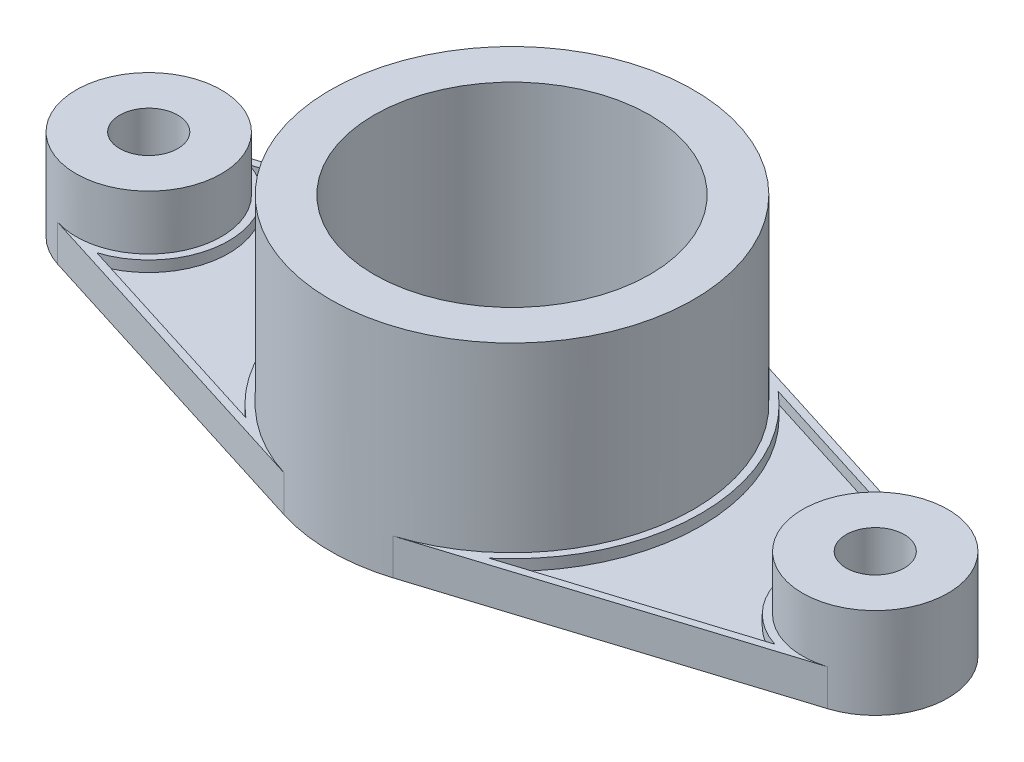
ISO-10303-21;
HEADER;
FILE_DESCRIPTION(('STEP AP214'),'2;1');
FILE_NAME('part.step','',(''),(''),'','','');
FILE_SCHEMA(('AUTOMOTIVE_DESIGN { 1 0 10303 214 1 1 1 1 }'));
ENDSEC;
DATA;
#1=APPLICATION_CONTEXT('core data for automotive mechanical design processes');
#2=APPLICATION_PROTOCOL_DEFINITION('international standard','automotive_design',2000,#1);
#3=PRODUCT_CONTEXT('',#1,'mechanical');
#4=PRODUCT('Part','Part','',(#3));
#5=PRODUCT_RELATED_PRODUCT_CATEGORY('part','',(#4));
#6=PRODUCT_DEFINITION_FORMATION('','',#4);
#7=PRODUCT_DEFINITION_CONTEXT('part definition',#1,'design');
#8=PRODUCT_DEFINITION('design','',#6,#7);
#9=PRODUCT_DEFINITION_SHAPE('','',#8);
#10=(LENGTH_UNIT() NAMED_UNIT(*) SI_UNIT(.MILLI.,.METRE.));
#11=(NAMED_UNIT(*) PLANE_ANGLE_UNIT() SI_UNIT($,.RADIAN.));
#12=(NAMED_UNIT(*) SI_UNIT($,.STERADIAN.) SOLID_ANGLE_UNIT());
#13=UNCERTAINTY_MEASURE_WITH_UNIT(LENGTH_MEASURE(1.E-05),#10,'distance_accuracy_value','');
#14=(GEOMETRIC_REPRESENTATION_CONTEXT(3) GLOBAL_UNCERTAINTY_ASSIGNED_CONTEXT((#13)) GLOBAL_UNIT_ASSIGNED_CONTEXT((#10,
#11,#12)) REPRESENTATION_CONTEXT('',''));
#15=CARTESIAN_POINT('',(0.,0.,0.));
#16=DIRECTION('',(0.,0.,1.));
#17=DIRECTION('',(1.,0.,0.));
#18=AXIS2_PLACEMENT_3D('',#15,#16,#17);
#19=CARTESIAN_POINT('',(0.,10.,0.));
#20=DIRECTION('',(0.,1.,0.));
#21=DIRECTION('',(0.,0.,1.));
#22=AXIS2_PLACEMENT_3D('',#19,#20,#21);
#23=PLANE('',#22);
#24=CARTESIAN_POINT('',(-99.9999999999994,10.,6.93889390390723E-13));
#25=DIRECTION('',(0.,-1.,0.));
#26=DIRECTION('',(0.,0.,-1.));
#27=AXIS2_PLACEMENT_3D('',#24,#25,#26);
#28=CIRCLE('',#27,22.);
#29=CARTESIAN_POINT('',(-93.3335174968009,10.,-20.9656388177064));
#30=VERTEX_POINT('',#29);
#31=CARTESIAN_POINT('',(-93.3335174968006,10.,20.9656388177077));
#32=VERTEX_POINT('',#31);
#33=EDGE_CURVE('E63',#30,#32,#28,.T.);
#34=ORIENTED_EDGE('',*,*,#33,.F.);
#35=DIRECTION('',(-0.953939201416943,0.,0.300000000000007));
#36=VECTOR('',#35,1.);
#37=CARTESIAN_POINT('',(-93.3335174968009,10.,-20.9656388177064));
#38=LINE('',#37,#36);
#39=CARTESIAN_POINT('',(-33.4787840283386,10.,-39.7890816680132));
#40=VERTEX_POINT('',#39);
#41=EDGE_CURVE('E183',#40,#30,#38,.T.);
#42=ORIENTED_EDGE('',*,*,#41,.F.);
#43=CARTESIAN_POINT('',(0.,10.,0.));
#44=DIRECTION('',(0.,-1.,0.));
#45=DIRECTION('',(0.,0.,-1.));
#46=AXIS2_PLACEMENT_3D('',#43,#44,#45);
#47=CIRCLE('',#46,51.9999999999996);
#48=CARTESIAN_POINT('',(-33.478784028338,10.,39.7890816680136));
#49=VERTEX_POINT('',#48);
#50=EDGE_CURVE('E187',#49,#40,#47,.T.);
#51=ORIENTED_EDGE('',*,*,#50,.F.);
#52=DIRECTION('',(0.953939201416948,0.,0.299999999999993));
#53=VECTOR('',#52,1.);
#54=CARTESIAN_POINT('',(-33.478784028338,10.,39.7890816680136));
#55=LINE('',#54,#53);
#56=EDGE_CURVE('E196',#32,#49,#55,.T.);
#57=ORIENTED_EDGE('',*,*,#56,.F.);
#58=EDGE_LOOP('',(#34,#42,#51,#57));
#59=FACE_BOUND('',#58,.T.);
#60=DIRECTION('',(-0.953939201416946,0.,-0.3));
#61=VECTOR('',#60,1.);
#62=CARTESIAN_POINT('',(-15.,10.,47.6969600708473));
#63=LINE('',#62,#61);
#64=CARTESIAN_POINT('',(-15.,10.,47.6969600708473));
#65=VERTEX_POINT('',#64);
#66=CARTESIAN_POINT('',(-106.,10.,19.0787840283389));
#67=VERTEX_POINT('',#66);
#68=EDGE_CURVE('E292',#65,#67,#63,.T.);
#69=ORIENTED_EDGE('',*,*,#68,.F.);
#70=CARTESIAN_POINT('',(0.,10.,0.));
#71=DIRECTION('',(0.,1.,0.));
#72=DIRECTION('',(0.,0.,1.));
#73=AXIS2_PLACEMENT_3D('',#70,#71,#72);
#74=CIRCLE('',#73,50.);
#75=CARTESIAN_POINT('',(-15.,10.,-47.6969600708473));
#76=VERTEX_POINT('',#75);
#77=EDGE_CURVE('E261',#65,#76,#74,.F.);
#78=ORIENTED_EDGE('',*,*,#77,.T.);
#79=DIRECTION('',(-0.953939201416946,0.,0.3));
#80=VECTOR('',#79,1.);
#81=CARTESIAN_POINT('',(-15.,10.,-47.6969600708473));
#82=LINE('',#81,#80);
#83=CARTESIAN_POINT('',(-106.,10.,-19.0787840283389));
#84=VERTEX_POINT('',#83);
#85=EDGE_CURVE('E288',#76,#84,#82,.T.);
#86=ORIENTED_EDGE('',*,*,#85,.T.);
#87=CARTESIAN_POINT('',(-100.,10.,0.));
#88=DIRECTION('',(0.,1.,0.));
#89=DIRECTION('',(0.,0.,1.));
#90=AXIS2_PLACEMENT_3D('',#87,#88,#89);
#91=CIRCLE('',#90,20.);
#92=EDGE_CURVE('E283',#67,#84,#91,.T.);
#93=ORIENTED_EDGE('',*,*,#92,.F.);
#94=EDGE_LOOP('',(#69,#78,#86,#93));
#95=FACE_BOUND('',#94,.T.);
#96=ADVANCED_FACE('F47',(#59,#95),#23,.T.);
#97=CARTESIAN_POINT('',(100.,10.,0.));
#98=DIRECTION('',(0.,-1.,0.));
#99=DIRECTION('',(0.,0.,1.));
#100=AXIS2_PLACEMENT_3D('',#97,#98,#99);
#101=CIRCLE('',#100,22.);
#102=CARTESIAN_POINT('',(93.3335174968013,10.,20.9656388177071));
#103=VERTEX_POINT('',#102);
#104=CARTESIAN_POINT('',(93.3335174968013,10.,-20.9656388177071));
#105=VERTEX_POINT('',#104);
#106=EDGE_CURVE('E71',#103,#105,#101,.T.);
#107=ORIENTED_EDGE('',*,*,#106,.F.);
#108=DIRECTION('',(0.953939201416946,0.,-0.3));
#109=VECTOR('',#108,1.);
#110=CARTESIAN_POINT('',(33.4787840283389,10.,39.7890816680134));
#111=LINE('',#110,#109);
#112=CARTESIAN_POINT('',(33.4787840283389,10.,39.7890816680134));
#113=VERTEX_POINT('',#112);
#114=EDGE_CURVE('E224',#113,#103,#111,.T.);
#115=ORIENTED_EDGE('',*,*,#114,.F.);
#116=CARTESIAN_POINT('',(0.,10.,0.));
#117=DIRECTION('',(0.,-1.,0.));
#118=DIRECTION('',(0.,0.,1.));
#119=AXIS2_PLACEMENT_3D('',#116,#117,#118);
#120=CIRCLE('',#119,52.);
#121=CARTESIAN_POINT('',(33.4787840283389,10.,-39.7890816680134));
#122=VERTEX_POINT('',#121);
#123=EDGE_CURVE('E228',#122,#113,#120,.T.);
#124=ORIENTED_EDGE('',*,*,#123,.F.);
#125=DIRECTION('',(-0.953939201416946,0.,-0.3));
#126=VECTOR('',#125,1.);
#127=CARTESIAN_POINT('',(93.3335174968013,10.,-20.9656388177071));
#128=LINE('',#127,#126);
#129=EDGE_CURVE('E233',#105,#122,#128,.T.);
#130=ORIENTED_EDGE('',*,*,#129,.F.);
#131=EDGE_LOOP('',(#107,#115,#124,#130));
#132=FACE_BOUND('',#131,.T.);
#133=DIRECTION('',(0.953939201416946,0.,0.3));
#134=VECTOR('',#133,1.);
#135=CARTESIAN_POINT('',(15.,10.,-47.6969600708473));
#136=LINE('',#135,#134);
#137=CARTESIAN_POINT('',(15.,10.,-47.6969600708473));
#138=VERTEX_POINT('',#137);
#139=CARTESIAN_POINT('',(106.,10.,-19.0787840283389));
#140=VERTEX_POINT('',#139);
#141=EDGE_CURVE('E301',#138,#140,#136,.T.);
#142=ORIENTED_EDGE('',*,*,#141,.F.);
#143=CARTESIAN_POINT('',(15.,10.,47.6969600708473));
#144=VERTEX_POINT('',#143);
#145=EDGE_CURVE('E260',#138,#144,#74,.F.);
#146=ORIENTED_EDGE('',*,*,#145,.T.);
#147=DIRECTION('',(0.953939201416946,0.,-0.3));
#148=VECTOR('',#147,1.);
#149=CARTESIAN_POINT('',(15.,10.,47.6969600708473));
#150=LINE('',#149,#148);
#151=CARTESIAN_POINT('',(106.,10.,19.0787840283389));
#152=VERTEX_POINT('',#151);
#153=EDGE_CURVE('E297',#144,#152,#150,.T.);
#154=ORIENTED_EDGE('',*,*,#153,.T.);
#155=CARTESIAN_POINT('',(100.,10.,0.));
#156=DIRECTION('',(0.,1.,0.));
#157=DIRECTION('',(0.,0.,1.));
#158=AXIS2_PLACEMENT_3D('',#155,#156,#157);
#159=CIRCLE('',#158,20.);
#160=EDGE_CURVE('E272',#152,#140,#159,.F.);
#161=ORIENTED_EDGE('',*,*,#160,.T.);
#162=EDGE_LOOP('',(#142,#146,#154,#161));
#163=FACE_BOUND('',#162,.T.);
#164=ADVANCED_FACE('F391',(#132,#163),#23,.T.);
#165=CARTESIAN_POINT('',(-15.,10.,-47.6969600708473));
#166=DIRECTION('',(0.3,0.,0.953939201416946));
#167=DIRECTION('',(0.953939201416946,0.,-0.3));
#168=AXIS2_PLACEMENT_3D('',#165,#166,#167);
#169=PLANE('',#168);
#170=DIRECTION('',(-0.953939201416946,0.,0.3));
#171=VECTOR('',#170,1.);
#172=CARTESIAN_POINT('',(-15.,0.,-47.6969600708473));
#173=LINE('',#172,#171);
#174=CARTESIAN_POINT('',(-15.,0.,-47.6969600708473));
#175=VERTEX_POINT('',#174);
#176=CARTESIAN_POINT('',(-106.,0.,-19.0787840283389));
#177=VERTEX_POINT('',#176);
#178=EDGE_CURVE('E287',#175,#177,#173,.T.);
#179=ORIENTED_EDGE('',*,*,#178,.T.);
#180=DIRECTION('',(0.,-1.,0.));
#181=VECTOR('',#180,1.);
#182=CARTESIAN_POINT('',(-106.,10.,-19.0787840283389));
#183=LINE('',#182,#181);
#184=EDGE_CURVE('E11',#84,#177,#183,.T.);
#185=ORIENTED_EDGE('',*,*,#184,.F.);
#186=ORIENTED_EDGE('',*,*,#85,.F.);
#187=DIRECTION('',(0.,-1.,0.));
#188=VECTOR('',#187,1.);
#189=CARTESIAN_POINT('',(-15.,10.,-47.6969600708473));
#190=LINE('',#189,#188);
#191=EDGE_CURVE('E305',#76,#175,#190,.T.);
#192=ORIENTED_EDGE('',*,*,#191,.T.);
#193=EDGE_LOOP('',(#179,#185,#186,#192));
#194=FACE_BOUND('',#193,.T.);
#195=ADVANCED_FACE('F49',(#194),#169,.F.);
#196=CARTESIAN_POINT('',(-100.,10.,0.));
#197=DIRECTION('',(0.,-1.,0.));
#198=DIRECTION('',(0.,0.,-1.));
#199=AXIS2_PLACEMENT_3D('',#196,#197,#198);
#200=CYLINDRICAL_SURFACE('',#199,20.);
#201=CARTESIAN_POINT('',(-100.,0.,0.));
#202=DIRECTION('',(0.,1.,0.));
#203=DIRECTION('',(0.,0.,1.));
#204=AXIS2_PLACEMENT_3D('',#201,#202,#203);
#205=CIRCLE('',#204,20.);
#206=CARTESIAN_POINT('',(-106.,0.,19.0787840283389));
#207=VERTEX_POINT('',#206);
#208=EDGE_CURVE('E309',#207,#177,#205,.F.);
#209=ORIENTED_EDGE('',*,*,#208,.F.);
#210=DIRECTION('',(0.,-1.,0.));
#211=VECTOR('',#210,1.);
#212=CARTESIAN_POINT('',(-106.,10.,19.0787840283389));
#213=LINE('',#212,#211);
#214=EDGE_CURVE('E56',#67,#207,#213,.T.);
#215=ORIENTED_EDGE('',*,*,#214,.F.);
#216=ORIENTED_EDGE('',*,*,#92,.T.);
#217=ORIENTED_EDGE('',*,*,#184,.T.);
#218=EDGE_LOOP('',(#209,#215,#216,#217));
#219=FACE_BOUND('',#218,.T.);
#220=CARTESIAN_POINT('',(-100.,25.,0.));
#221=DIRECTION('',(0.,1.,0.));
#222=DIRECTION('',(0.,0.,1.));
#223=AXIS2_PLACEMENT_3D('',#220,#221,#222);
#224=CIRCLE('',#223,20.);
#225=CARTESIAN_POINT('',(-100.,25.,20.));
#226=VERTEX_POINT('',#225);
#227=EDGE_CURVE('E275',#226,#226,#224,.F.);
#228=ORIENTED_EDGE('',*,*,#227,.T.);
#229=EDGE_LOOP('',(#228));
#230=FACE_BOUND('',#229,.T.);
#231=ADVANCED_FACE('F370',(#219,#230),#200,.T.);
#232=CARTESIAN_POINT('',(-15.,10.,47.6969600708473));
#233=DIRECTION('',(-0.3,0.,0.953939201416946));
#234=DIRECTION('',(0.953939201416946,0.,0.3));
#235=AXIS2_PLACEMENT_3D('',#232,#233,#234);
#236=PLANE('',#235);
#237=DIRECTION('',(-0.953939201416946,0.,-0.3));
#238=VECTOR('',#237,1.);
#239=CARTESIAN_POINT('',(-15.,0.,47.6969600708473));
#240=LINE('',#239,#238);
#241=CARTESIAN_POINT('',(-15.,0.,47.6969600708473));
#242=VERTEX_POINT('',#241);
#243=EDGE_CURVE('E313',#242,#207,#240,.T.);
#244=ORIENTED_EDGE('',*,*,#243,.F.);
#245=DIRECTION('',(0.,-1.,0.));
#246=VECTOR('',#245,1.);
#247=CARTESIAN_POINT('',(-15.,10.,47.6969600708473));
#248=LINE('',#247,#246);
#249=EDGE_CURVE('E360',#65,#242,#248,.T.);
#250=ORIENTED_EDGE('',*,*,#249,.F.);
#251=ORIENTED_EDGE('',*,*,#68,.T.);
#252=ORIENTED_EDGE('',*,*,#214,.T.);
#253=EDGE_LOOP('',(#244,#250,#251,#252));
#254=FACE_BOUND('',#253,.T.);
#255=ADVANCED_FACE('F367',(#254),#236,.T.);
#256=CARTESIAN_POINT('',(15.,10.,47.6969600708473));
#257=DIRECTION('',(-0.3,0.,-0.953939201416946));
#258=DIRECTION('',(-0.953939201416946,0.,0.3));
#259=AXIS2_PLACEMENT_3D('',#256,#257,#258);
#260=PLANE('',#259);
#261=DIRECTION('',(0.953939201416946,0.,-0.3));
#262=VECTOR('',#261,1.);
#263=CARTESIAN_POINT('',(15.,0.,47.6969600708473));
#264=LINE('',#263,#262);
#265=CARTESIAN_POINT('',(15.,0.,47.6969600708473));
#266=VERTEX_POINT('',#265);
#267=CARTESIAN_POINT('',(106.,0.,19.0787840283389));
#268=VERTEX_POINT('',#267);
#269=EDGE_CURVE('E320',#266,#268,#264,.T.);
#270=ORIENTED_EDGE('',*,*,#269,.T.);
#271=DIRECTION('',(0.,-1.,0.));
#272=VECTOR('',#271,1.);
#273=CARTESIAN_POINT('',(106.,10.,19.0787840283389));
#274=LINE('',#273,#272);
#275=EDGE_CURVE('E352',#152,#268,#274,.T.);
#276=ORIENTED_EDGE('',*,*,#275,.F.);
#277=ORIENTED_EDGE('',*,*,#153,.F.);
#278=DIRECTION('',(0.,-1.,0.));
#279=VECTOR('',#278,1.);
#280=CARTESIAN_POINT('',(15.,10.,47.6969600708473));
#281=LINE('',#280,#279);
#282=EDGE_CURVE('E356',#144,#266,#281,.T.);
#283=ORIENTED_EDGE('',*,*,#282,.T.);
#284=EDGE_LOOP('',(#270,#276,#277,#283));
#285=FACE_BOUND('',#284,.T.);
#286=ADVANCED_FACE('F387',(#285),#260,.F.);
#287=CARTESIAN_POINT('',(100.,10.,0.));
#288=DIRECTION('',(0.,-1.,0.));
#289=DIRECTION('',(0.,0.,-1.));
#290=AXIS2_PLACEMENT_3D('',#287,#288,#289);
#291=CYLINDRICAL_SURFACE('',#290,20.);
#292=CARTESIAN_POINT('',(100.,0.,0.));
#293=DIRECTION('',(0.,1.,0.));
#294=DIRECTION('',(0.,0.,1.));
#295=AXIS2_PLACEMENT_3D('',#292,#293,#294);
#296=CIRCLE('',#295,20.);
#297=CARTESIAN_POINT('',(106.,0.,-19.0787840283389));
#298=VERTEX_POINT('',#297);
#299=EDGE_CURVE('E324',#268,#298,#296,.T.);
#300=ORIENTED_EDGE('',*,*,#299,.T.);
#301=DIRECTION('',(0.,-1.,0.));
#302=VECTOR('',#301,1.);
#303=CARTESIAN_POINT('',(106.,10.,-19.0787840283389));
#304=LINE('',#303,#302);
#305=EDGE_CURVE('E349',#140,#298,#304,.T.);
#306=ORIENTED_EDGE('',*,*,#305,.F.);
#307=ORIENTED_EDGE('',*,*,#160,.F.);
#308=ORIENTED_EDGE('',*,*,#275,.T.);
#309=EDGE_LOOP('',(#300,#306,#307,#308));
#310=FACE_BOUND('',#309,.T.);
#311=CARTESIAN_POINT('',(100.,25.,0.));
#312=DIRECTION('',(0.,1.,0.));
#313=DIRECTION('',(0.,0.,1.));
#314=AXIS2_PLACEMENT_3D('',#311,#312,#313);
#315=CIRCLE('',#314,20.);
#316=CARTESIAN_POINT('',(100.,25.,20.));
#317=VERTEX_POINT('',#316);
#318=EDGE_CURVE('E268',#317,#317,#315,.T.);
#319=ORIENTED_EDGE('',*,*,#318,.F.);
#320=EDGE_LOOP('',(#319));
#321=FACE_BOUND('',#320,.T.);
#322=ADVANCED_FACE('F432',(#310,#321),#291,.T.);
#323=CARTESIAN_POINT('',(15.,10.,-47.6969600708473));
#324=DIRECTION('',(0.3,0.,-0.953939201416946));
#325=DIRECTION('',(-0.953939201416946,0.,-0.3));
#326=AXIS2_PLACEMENT_3D('',#323,#324,#325);
#327=PLANE('',#326);
#328=DIRECTION('',(0.953939201416946,0.,0.3));
#329=VECTOR('',#328,1.);
#330=CARTESIAN_POINT('',(15.,0.,-47.6969600708473));
#331=LINE('',#330,#329);
#332=CARTESIAN_POINT('',(15.,0.,-47.6969600708473));
#333=VERTEX_POINT('',#332);
#334=EDGE_CURVE('E328',#333,#298,#331,.T.);
#335=ORIENTED_EDGE('',*,*,#334,.F.);
#336=DIRECTION('',(0.,-1.,0.));
#337=VECTOR('',#336,1.);
#338=CARTESIAN_POINT('',(15.,10.,-47.6969600708473));
#339=LINE('',#338,#337);
#340=EDGE_CURVE('E346',#138,#333,#339,.T.);
#341=ORIENTED_EDGE('',*,*,#340,.F.);
#342=ORIENTED_EDGE('',*,*,#141,.T.);
#343=ORIENTED_EDGE('',*,*,#305,.T.);
#344=EDGE_LOOP('',(#335,#341,#342,#343));
#345=FACE_BOUND('',#344,.T.);
#346=ADVANCED_FACE('F423',(#345),#327,.T.);
#347=CARTESIAN_POINT('',(-100.,10.,0.));
#348=DIRECTION('',(0.,-1.,0.));
#349=DIRECTION('',(0.,0.,-1.));
#350=AXIS2_PLACEMENT_3D('',#347,#348,#349);
#351=CYLINDRICAL_SURFACE('',#350,8.00000000000001);
#352=CARTESIAN_POINT('',(-100.,0.,0.));
#353=DIRECTION('',(0.,1.,0.));
#354=DIRECTION('',(0.,0.,1.));
#355=AXIS2_PLACEMENT_3D('',#352,#353,#354);
#356=CIRCLE('',#355,8.00000000000001);
#357=CARTESIAN_POINT('',(-100.,0.,8.00000000000004));
#358=VERTEX_POINT('',#357);
#359=EDGE_CURVE('E336',#358,#358,#356,.F.);
#360=ORIENTED_EDGE('',*,*,#359,.T.);
#361=EDGE_LOOP('',(#360));
#362=FACE_BOUND('',#361,.T.);
#363=CARTESIAN_POINT('',(-100.,25.,0.));
#364=DIRECTION('',(0.,1.,0.));
#365=DIRECTION('',(0.,0.,1.));
#366=AXIS2_PLACEMENT_3D('',#363,#364,#365);
#367=CIRCLE('',#366,8.00000000000001);
#368=CARTESIAN_POINT('',(-100.,25.,8.00000000000004));
#369=VERTEX_POINT('',#368);
#370=EDGE_CURVE('E279',#369,#369,#367,.F.);
#371=ORIENTED_EDGE('',*,*,#370,.F.);
#372=EDGE_LOOP('',(#371));
#373=FACE_BOUND('',#372,.T.);
#374=ADVANCED_FACE('F419',(#362,#373),#351,.F.);
#375=CARTESIAN_POINT('',(0.,10.,0.));
#376=DIRECTION('',(0.,-1.,0.));
#377=DIRECTION('',(0.,0.,-1.));
#378=AXIS2_PLACEMENT_3D('',#375,#376,#377);
#379=CYLINDRICAL_SURFACE('',#378,38.);
#380=CARTESIAN_POINT('',(0.,0.,0.));
#381=DIRECTION('',(0.,1.,0.));
#382=DIRECTION('',(0.,0.,1.));
#383=AXIS2_PLACEMENT_3D('',#380,#381,#382);
#384=CIRCLE('',#383,38.);
#385=CARTESIAN_POINT('',(0.,0.,38.));
#386=VERTEX_POINT('',#385);
#387=EDGE_CURVE('E332',#386,#386,#384,.T.);
#388=ORIENTED_EDGE('',*,*,#387,.F.);
#389=EDGE_LOOP('',(#388));
#390=FACE_BOUND('',#389,.T.);
#391=CARTESIAN_POINT('',(0.,60.,0.));
#392=DIRECTION('',(0.,1.,0.));
#393=DIRECTION('',(0.,0.,1.));
#394=AXIS2_PLACEMENT_3D('',#391,#392,#393);
#395=CIRCLE('',#394,38.);
#396=CARTESIAN_POINT('',(0.,60.,38.));
#397=VERTEX_POINT('',#396);
#398=EDGE_CURVE('E205',#397,#397,#395,.T.);
#399=ORIENTED_EDGE('',*,*,#398,.T.);
#400=EDGE_LOOP('',(#399));
#401=FACE_BOUND('',#400,.T.);
#402=ADVANCED_FACE('F422',(#390,#401),#379,.F.);
#403=CARTESIAN_POINT('',(0.,10.,0.));
#404=DIRECTION('',(0.,-1.,0.));
#405=DIRECTION('',(0.,0.,-1.));
#406=AXIS2_PLACEMENT_3D('',#403,#404,#405);
#407=CYLINDRICAL_SURFACE('',#406,50.);
#408=CARTESIAN_POINT('',(0.,0.,0.));
#409=DIRECTION('',(0.,1.,0.));
#410=DIRECTION('',(0.,0.,1.));
#411=AXIS2_PLACEMENT_3D('',#408,#409,#410);
#412=CIRCLE('',#411,50.);
#413=EDGE_CURVE('E321',#333,#175,#412,.T.);
#414=ORIENTED_EDGE('',*,*,#413,.T.);
#415=ORIENTED_EDGE('',*,*,#191,.F.);
#416=ORIENTED_EDGE('',*,*,#77,.F.);
#417=ORIENTED_EDGE('',*,*,#249,.T.);
#418=EDGE_CURVE('E317',#242,#266,#412,.T.);
#419=ORIENTED_EDGE('',*,*,#418,.T.);
#420=ORIENTED_EDGE('',*,*,#282,.F.);
#421=ORIENTED_EDGE('',*,*,#145,.F.);
#422=ORIENTED_EDGE('',*,*,#340,.T.);
#423=EDGE_LOOP('',(#414,#415,#416,#417,#419,#420,#421,#422));
#424=FACE_BOUND('',#423,.T.);
#425=CARTESIAN_POINT('',(0.,60.,0.));
#426=DIRECTION('',(0.,1.,0.));
#427=DIRECTION('',(0.,0.,1.));
#428=AXIS2_PLACEMENT_3D('',#425,#426,#427);
#429=CIRCLE('',#428,50.);
#430=CARTESIAN_POINT('',(0.,60.,50.));
#431=VERTEX_POINT('',#430);
#432=EDGE_CURVE('E256',#431,#431,#429,.T.);
#433=ORIENTED_EDGE('',*,*,#432,.F.);
#434=EDGE_LOOP('',(#433));
#435=FACE_BOUND('',#434,.T.);
#436=ADVANCED_FACE('F381',(#424,#435),#407,.T.);
#437=CARTESIAN_POINT('',(100.,10.,0.));
#438=DIRECTION('',(0.,-1.,0.));
#439=DIRECTION('',(0.,0.,-1.));
#440=AXIS2_PLACEMENT_3D('',#437,#438,#439);
#441=CYLINDRICAL_SURFACE('',#440,8.00000000000001);
#442=CARTESIAN_POINT('',(100.,0.,0.));
#443=DIRECTION('',(0.,1.,0.));
#444=DIRECTION('',(0.,0.,1.));
#445=AXIS2_PLACEMENT_3D('',#442,#443,#444);
#446=CIRCLE('',#445,8.00000000000001);
#447=CARTESIAN_POINT('',(100.,0.,8.00000000000001));
#448=VERTEX_POINT('',#447);
#449=EDGE_CURVE('E293',#448,#448,#446,.T.);
#450=ORIENTED_EDGE('',*,*,#449,.F.);
#451=EDGE_LOOP('',(#450));
#452=FACE_BOUND('',#451,.T.);
#453=CARTESIAN_POINT('',(100.,25.,0.));
#454=DIRECTION('',(0.,1.,0.));
#455=DIRECTION('',(0.,0.,1.));
#456=AXIS2_PLACEMENT_3D('',#453,#454,#455);
#457=CIRCLE('',#456,8.00000000000001);
#458=CARTESIAN_POINT('',(100.,25.,8.00000000000001));
#459=VERTEX_POINT('',#458);
#460=EDGE_CURVE('E264',#459,#459,#457,.T.);
#461=ORIENTED_EDGE('',*,*,#460,.T.);
#462=EDGE_LOOP('',(#461));
#463=FACE_BOUND('',#462,.T.);
#464=ADVANCED_FACE('F415',(#452,#463),#441,.F.);
#465=CARTESIAN_POINT('',(0.,0.,0.));
#466=DIRECTION('',(0.,1.,0.));
#467=DIRECTION('',(0.,0.,1.));
#468=AXIS2_PLACEMENT_3D('',#465,#466,#467);
#469=PLANE('',#468);
#470=ORIENTED_EDGE('',*,*,#418,.F.);
#471=ORIENTED_EDGE('',*,*,#243,.T.);
#472=ORIENTED_EDGE('',*,*,#208,.T.);
#473=ORIENTED_EDGE('',*,*,#178,.F.);
#474=ORIENTED_EDGE('',*,*,#413,.F.);
#475=ORIENTED_EDGE('',*,*,#334,.T.);
#476=ORIENTED_EDGE('',*,*,#299,.F.);
#477=ORIENTED_EDGE('',*,*,#269,.F.);
#478=EDGE_LOOP('',(#470,#471,#472,#473,#474,#475,#476,#477));
#479=FACE_BOUND('',#478,.T.);
#480=ORIENTED_EDGE('',*,*,#387,.T.);
#481=EDGE_LOOP('',(#480));
#482=FACE_BOUND('',#481,.T.);
#483=ORIENTED_EDGE('',*,*,#449,.T.);
#484=EDGE_LOOP('',(#483));
#485=FACE_BOUND('',#484,.T.);
#486=ORIENTED_EDGE('',*,*,#359,.F.);
#487=EDGE_LOOP('',(#486));
#488=FACE_BOUND('',#487,.T.);
#489=ADVANCED_FACE('F375',(#479,#482,#485,#488),#469,.F.);
#490=CARTESIAN_POINT('',(0.,25.,0.));
#491=DIRECTION('',(0.,1.,0.));
#492=DIRECTION('',(0.,0.,1.));
#493=AXIS2_PLACEMENT_3D('',#490,#491,#492);
#494=PLANE('',#493);
#495=ORIENTED_EDGE('',*,*,#227,.F.);
#496=EDGE_LOOP('',(#495));
#497=FACE_BOUND('',#496,.T.);
#498=ORIENTED_EDGE('',*,*,#370,.T.);
#499=EDGE_LOOP('',(#498));
#500=FACE_BOUND('',#499,.T.);
#501=ADVANCED_FACE('F411',(#497,#500),#494,.T.);
#502=CARTESIAN_POINT('',(0.,25.,0.));
#503=DIRECTION('',(0.,1.,0.));
#504=DIRECTION('',(0.,0.,1.));
#505=AXIS2_PLACEMENT_3D('',#502,#503,#504);
#506=PLANE('',#505);
#507=ORIENTED_EDGE('',*,*,#460,.F.);
#508=EDGE_LOOP('',(#507));
#509=FACE_BOUND('',#508,.T.);
#510=ORIENTED_EDGE('',*,*,#318,.T.);
#511=EDGE_LOOP('',(#510));
#512=FACE_BOUND('',#511,.T.);
#513=ADVANCED_FACE('F451',(#509,#512),#506,.T.);
#514=CARTESIAN_POINT('',(0.,60.,0.));
#515=DIRECTION('',(0.,1.,0.));
#516=DIRECTION('',(0.,0.,1.));
#517=AXIS2_PLACEMENT_3D('',#514,#515,#516);
#518=PLANE('',#517);
#519=ORIENTED_EDGE('',*,*,#398,.F.);
#520=EDGE_LOOP('',(#519));
#521=FACE_BOUND('',#520,.T.);
#522=ORIENTED_EDGE('',*,*,#432,.T.);
#523=EDGE_LOOP('',(#522));
#524=FACE_BOUND('',#523,.T.);
#525=ADVANCED_FACE('F484',(#521,#524),#518,.T.);
#526=CARTESIAN_POINT('',(100.,7.,0.));
#527=DIRECTION('',(0.,1.,0.));
#528=DIRECTION('',(0.,0.,1.));
#529=AXIS2_PLACEMENT_3D('',#526,#527,#528);
#530=CYLINDRICAL_SURFACE('',#529,22.);
#531=ORIENTED_EDGE('',*,*,#106,.T.);
#532=DIRECTION('',(0.,1.,0.));
#533=VECTOR('',#532,1.);
#534=CARTESIAN_POINT('',(93.3335174968013,7.,-20.9656388177071));
#535=LINE('',#534,#533);
#536=CARTESIAN_POINT('',(93.3335174968013,7.,-20.9656388177071));
#537=VERTEX_POINT('',#536);
#538=EDGE_CURVE('E211',#537,#105,#535,.T.);
#539=ORIENTED_EDGE('',*,*,#538,.F.);
#540=CARTESIAN_POINT('',(100.,7.,0.));
#541=DIRECTION('',(0.,-1.,0.));
#542=DIRECTION('',(0.,0.,1.));
#543=AXIS2_PLACEMENT_3D('',#540,#541,#542);
#544=CIRCLE('',#543,22.);
#545=CARTESIAN_POINT('',(93.3335174968013,7.,20.9656388177071));
#546=VERTEX_POINT('',#545);
#547=EDGE_CURVE('E229',#546,#537,#544,.T.);
#548=ORIENTED_EDGE('',*,*,#547,.F.);
#549=DIRECTION('',(0.,1.,0.));
#550=VECTOR('',#549,1.);
#551=CARTESIAN_POINT('',(93.3335174968013,7.,20.9656388177071));
#552=LINE('',#551,#550);
#553=EDGE_CURVE('E221',#546,#103,#552,.T.);
#554=ORIENTED_EDGE('',*,*,#553,.T.);
#555=EDGE_LOOP('',(#531,#539,#548,#554));
#556=FACE_BOUND('',#555,.T.);
#557=ADVANCED_FACE('F486',(#556),#530,.T.);
#558=CARTESIAN_POINT('',(33.4787840283389,7.,39.7890816680134));
#559=DIRECTION('',(0.3,0.,0.953939201416946));
#560=DIRECTION('',(0.953939201416946,0.,-0.3));
#561=AXIS2_PLACEMENT_3D('',#558,#559,#560);
#562=PLANE('',#561);
#563=ORIENTED_EDGE('',*,*,#114,.T.);
#564=ORIENTED_EDGE('',*,*,#553,.F.);
#565=DIRECTION('',(0.953939201416946,0.,-0.3));
#566=VECTOR('',#565,1.);
#567=CARTESIAN_POINT('',(33.4787840283389,7.,39.7890816680134));
#568=LINE('',#567,#566);
#569=CARTESIAN_POINT('',(33.4787840283389,7.,39.7890816680134));
#570=VERTEX_POINT('',#569);
#571=EDGE_CURVE('E214',#570,#546,#568,.T.);
#572=ORIENTED_EDGE('',*,*,#571,.F.);
#573=DIRECTION('',(0.,1.,0.));
#574=VECTOR('',#573,1.);
#575=CARTESIAN_POINT('',(33.4787840283389,7.,39.7890816680134));
#576=LINE('',#575,#574);
#577=EDGE_CURVE('E218',#570,#113,#576,.T.);
#578=ORIENTED_EDGE('',*,*,#577,.T.);
#579=EDGE_LOOP('',(#563,#564,#572,#578));
#580=FACE_BOUND('',#579,.T.);
#581=ADVANCED_FACE('F499',(#580),#562,.F.);
#582=CARTESIAN_POINT('',(0.,7.,0.));
#583=DIRECTION('',(0.,1.,0.));
#584=DIRECTION('',(0.,0.,1.));
#585=AXIS2_PLACEMENT_3D('',#582,#583,#584);
#586=CYLINDRICAL_SURFACE('',#585,52.);
#587=ORIENTED_EDGE('',*,*,#123,.T.);
#588=ORIENTED_EDGE('',*,*,#577,.F.);
#589=CARTESIAN_POINT('',(0.,7.,0.));
#590=DIRECTION('',(0.,-1.,0.));
#591=DIRECTION('',(0.,0.,1.));
#592=AXIS2_PLACEMENT_3D('',#589,#590,#591);
#593=CIRCLE('',#592,52.);
#594=CARTESIAN_POINT('',(33.4787840283389,7.,-39.7890816680134));
#595=VERTEX_POINT('',#594);
#596=EDGE_CURVE('E242',#595,#570,#593,.T.);
#597=ORIENTED_EDGE('',*,*,#596,.F.);
#598=DIRECTION('',(0.,1.,0.));
#599=VECTOR('',#598,1.);
#600=CARTESIAN_POINT('',(33.4787840283389,7.,-39.7890816680134));
#601=LINE('',#600,#599);
#602=EDGE_CURVE('E215',#595,#122,#601,.T.);
#603=ORIENTED_EDGE('',*,*,#602,.T.);
#604=EDGE_LOOP('',(#587,#588,#597,#603));
#605=FACE_BOUND('',#604,.T.);
#606=ADVANCED_FACE('F508',(#605),#586,.T.);
#607=CARTESIAN_POINT('',(93.3335174968013,7.,-20.9656388177071));
#608=DIRECTION('',(0.3,0.,-0.953939201416945));
#609=DIRECTION('',(-0.953939201416946,0.,-0.3));
#610=AXIS2_PLACEMENT_3D('',#607,#608,#609);
#611=PLANE('',#610);
#612=ORIENTED_EDGE('',*,*,#129,.T.);
#613=ORIENTED_EDGE('',*,*,#602,.F.);
#614=DIRECTION('',(-0.953939201416946,0.,-0.3));
#615=VECTOR('',#614,1.);
#616=CARTESIAN_POINT('',(93.3335174968013,7.,-20.9656388177071));
#617=LINE('',#616,#615);
#618=EDGE_CURVE('E246',#537,#595,#617,.T.);
#619=ORIENTED_EDGE('',*,*,#618,.F.);
#620=ORIENTED_EDGE('',*,*,#538,.T.);
#621=EDGE_LOOP('',(#612,#613,#619,#620));
#622=FACE_BOUND('',#621,.T.);
#623=ADVANCED_FACE('F518',(#622),#611,.F.);
#624=CARTESIAN_POINT('',(100.,7.,0.));
#625=DIRECTION('',(0.,1.,0.));
#626=DIRECTION('',(0.,0.,1.));
#627=AXIS2_PLACEMENT_3D('',#624,#625,#626);
#628=PLANE('',#627);
#629=ORIENTED_EDGE('',*,*,#547,.T.);
#630=ORIENTED_EDGE('',*,*,#618,.T.);
#631=ORIENTED_EDGE('',*,*,#596,.T.);
#632=ORIENTED_EDGE('',*,*,#571,.T.);
#633=EDGE_LOOP('',(#629,#630,#631,#632));
#634=FACE_BOUND('',#633,.T.);
#635=ADVANCED_FACE('F528',(#634),#628,.T.);
#636=CARTESIAN_POINT('',(-99.9999999999994,7.,6.93889390390723E-13));
#637=DIRECTION('',(0.,1.,0.));
#638=DIRECTION('',(0.,0.,1.));
#639=AXIS2_PLACEMENT_3D('',#636,#637,#638);
#640=CYLINDRICAL_SURFACE('',#639,22.);
#641=ORIENTED_EDGE('',*,*,#33,.T.);
#642=DIRECTION('',(0.,1.,0.));
#643=VECTOR('',#642,1.);
#644=CARTESIAN_POINT('',(-93.3335174968006,7.,20.9656388177077));
#645=LINE('',#644,#643);
#646=CARTESIAN_POINT('',(-93.3335174968006,7.,20.9656388177077));
#647=VERTEX_POINT('',#646);
#648=EDGE_CURVE('E158',#647,#32,#645,.T.);
#649=ORIENTED_EDGE('',*,*,#648,.F.);
#650=CARTESIAN_POINT('',(-99.9999999999994,7.,6.93889390390723E-13));
#651=DIRECTION('',(0.,-1.,0.));
#652=DIRECTION('',(0.,0.,-1.));
#653=AXIS2_PLACEMENT_3D('',#650,#651,#652);
#654=CIRCLE('',#653,22.);
#655=CARTESIAN_POINT('',(-93.3335174968009,7.,-20.9656388177064));
#656=VERTEX_POINT('',#655);
#657=EDGE_CURVE('E162',#656,#647,#654,.T.);
#658=ORIENTED_EDGE('',*,*,#657,.F.);
#659=DIRECTION('',(0.,1.,0.));
#660=VECTOR('',#659,1.);
#661=CARTESIAN_POINT('',(-93.3335174968009,7.,-20.9656388177064));
#662=LINE('',#661,#660);
#663=EDGE_CURVE('E202',#656,#30,#662,.T.);
#664=ORIENTED_EDGE('',*,*,#663,.T.);
#665=EDGE_LOOP('',(#641,#649,#658,#664));
#666=FACE_BOUND('',#665,.T.);
#667=ADVANCED_FACE('F160',(#666),#640,.T.);
#668=CARTESIAN_POINT('',(-93.3335174968009,7.,-20.9656388177064));
#669=DIRECTION('',(-0.300000000000007,0.,-0.953939201416944));
#670=DIRECTION('',(-0.953939201416944,0.,0.300000000000007));
#671=AXIS2_PLACEMENT_3D('',#668,#669,#670);
#672=PLANE('',#671);
#673=ORIENTED_EDGE('',*,*,#41,.T.);
#674=ORIENTED_EDGE('',*,*,#663,.F.);
#675=DIRECTION('',(-0.953939201416943,0.,0.300000000000007));
#676=VECTOR('',#675,1.);
#677=CARTESIAN_POINT('',(-93.3335174968009,7.,-20.9656388177064));
#678=LINE('',#677,#676);
#679=CARTESIAN_POINT('',(-33.4787840283386,7.,-39.7890816680132));
#680=VERTEX_POINT('',#679);
#681=EDGE_CURVE('E169',#680,#656,#678,.T.);
#682=ORIENTED_EDGE('',*,*,#681,.F.);
#683=DIRECTION('',(0.,1.,0.));
#684=VECTOR('',#683,1.);
#685=CARTESIAN_POINT('',(-33.4787840283386,7.,-39.7890816680132));
#686=LINE('',#685,#684);
#687=EDGE_CURVE('E206',#680,#40,#686,.T.);
#688=ORIENTED_EDGE('',*,*,#687,.T.);
#689=EDGE_LOOP('',(#673,#674,#682,#688));
#690=FACE_BOUND('',#689,.T.);
#691=ADVANCED_FACE('F547',(#690),#672,.F.);
#692=CARTESIAN_POINT('',(0.,7.,0.));
#693=DIRECTION('',(0.,1.,0.));
#694=DIRECTION('',(0.,0.,1.));
#695=AXIS2_PLACEMENT_3D('',#692,#693,#694);
#696=CYLINDRICAL_SURFACE('',#695,51.9999999999996);
#697=ORIENTED_EDGE('',*,*,#50,.T.);
#698=ORIENTED_EDGE('',*,*,#687,.F.);
#699=CARTESIAN_POINT('',(0.,7.,0.));
#700=DIRECTION('',(0.,-1.,0.));
#701=DIRECTION('',(0.,0.,-1.));
#702=AXIS2_PLACEMENT_3D('',#699,#700,#701);
#703=CIRCLE('',#702,51.9999999999996);
#704=CARTESIAN_POINT('',(-33.478784028338,7.,39.7890816680136));
#705=VERTEX_POINT('',#704);
#706=EDGE_CURVE('E178',#705,#680,#703,.T.);
#707=ORIENTED_EDGE('',*,*,#706,.F.);
#708=DIRECTION('',(0.,1.,0.));
#709=VECTOR('',#708,1.);
#710=CARTESIAN_POINT('',(-33.478784028338,7.,39.7890816680136));
#711=LINE('',#710,#709);
#712=EDGE_CURVE('E168',#705,#49,#711,.T.);
#713=ORIENTED_EDGE('',*,*,#712,.T.);
#714=EDGE_LOOP('',(#697,#698,#707,#713));
#715=FACE_BOUND('',#714,.T.);
#716=ADVANCED_FACE('F556',(#715),#696,.T.);
#717=CARTESIAN_POINT('',(-33.478784028338,7.,39.7890816680136));
#718=DIRECTION('',(-0.299999999999993,0.,0.953939201416948));
#719=DIRECTION('',(0.953939201416948,0.,0.299999999999993));
#720=AXIS2_PLACEMENT_3D('',#717,#718,#719);
#721=PLANE('',#720);
#722=ORIENTED_EDGE('',*,*,#56,.T.);
#723=ORIENTED_EDGE('',*,*,#712,.F.);
#724=DIRECTION('',(0.953939201416948,0.,0.299999999999993));
#725=VECTOR('',#724,1.);
#726=CARTESIAN_POINT('',(-33.478784028338,7.,39.7890816680136));
#727=LINE('',#726,#725);
#728=EDGE_CURVE('E172',#647,#705,#727,.T.);
#729=ORIENTED_EDGE('',*,*,#728,.F.);
#730=ORIENTED_EDGE('',*,*,#648,.T.);
#731=EDGE_LOOP('',(#722,#723,#729,#730));
#732=FACE_BOUND('',#731,.T.);
#733=ADVANCED_FACE('F173',(#732),#721,.F.);
#734=CARTESIAN_POINT('',(-99.9999999999994,7.,6.93889390390723E-13));
#735=DIRECTION('',(0.,-1.,0.));
#736=DIRECTION('',(0.,0.,-1.));
#737=AXIS2_PLACEMENT_3D('',#734,#735,#736);
#738=PLANE('',#737);
#739=ORIENTED_EDGE('',*,*,#657,.T.);
#740=ORIENTED_EDGE('',*,*,#728,.T.);
#741=ORIENTED_EDGE('',*,*,#706,.T.);
#742=ORIENTED_EDGE('',*,*,#681,.T.);
#743=EDGE_LOOP('',(#739,#740,#741,#742));
#744=FACE_BOUND('',#743,.T.);
#745=ADVANCED_FACE('F180',(#744),#738,.F.);
#746=CLOSED_SHELL('',(#96,#164,#195,#231,#255,#286,#322,#346,#374,#402,#436,#464,#489,#501,#513,
#525,#557,#581,#606,#623,#635,#667,#691,#716,#733,#745));
#747=MANIFOLD_SOLID_BREP('B2',#746);
#748=ADVANCED_BREP_SHAPE_REPRESENTATION('',(#18,#747),#14);
#749=SHAPE_DEFINITION_REPRESENTATION(#9,#748);
ENDSEC;
END-ISO-10303-21;
